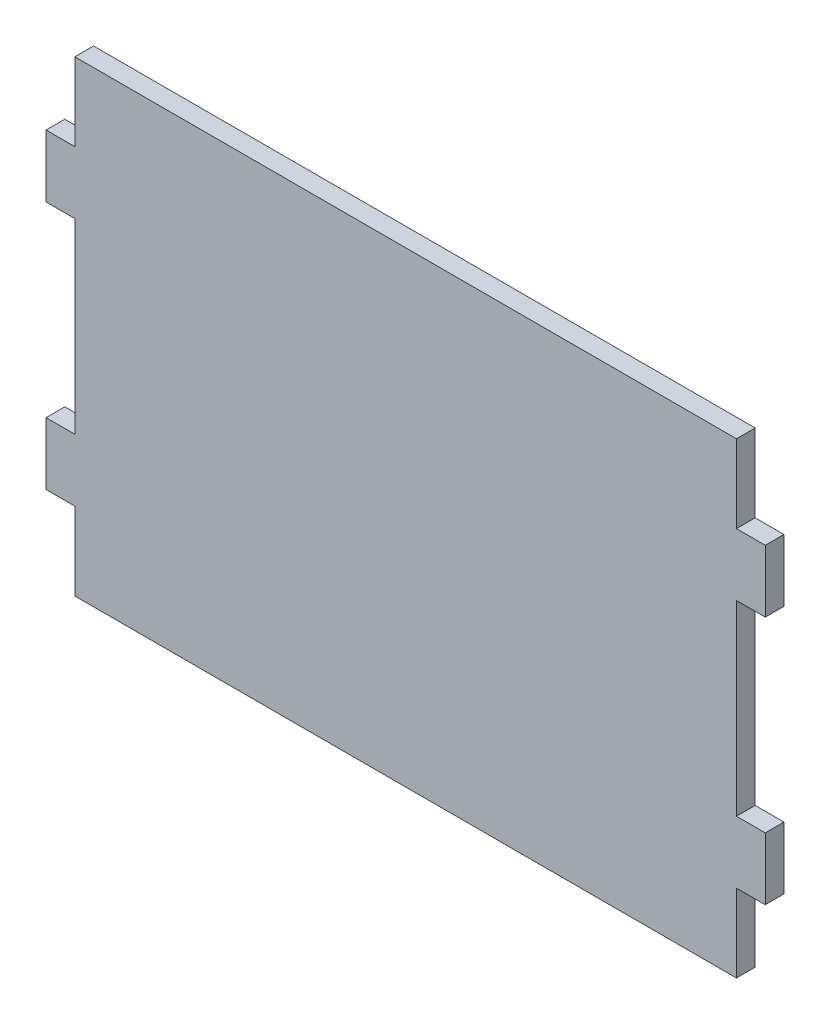
ISO-10303-21;
HEADER;
FILE_DESCRIPTION(('STEP AP214'),'2;1');
FILE_NAME('part.step','',(''),(''),'','','');
FILE_SCHEMA(('AUTOMOTIVE_DESIGN { 1 0 10303 214 1 1 1 1 }'));
ENDSEC;
DATA;
#1=APPLICATION_CONTEXT('core data for automotive mechanical design processes');
#2=APPLICATION_PROTOCOL_DEFINITION('international standard','automotive_design',2000,#1);
#3=PRODUCT_CONTEXT('',#1,'mechanical');
#4=PRODUCT('Part','Part','',(#3));
#5=PRODUCT_RELATED_PRODUCT_CATEGORY('part','',(#4));
#6=PRODUCT_DEFINITION_FORMATION('','',#4);
#7=PRODUCT_DEFINITION_CONTEXT('part definition',#1,'design');
#8=PRODUCT_DEFINITION('design','',#6,#7);
#9=PRODUCT_DEFINITION_SHAPE('','',#8);
#10=(LENGTH_UNIT() NAMED_UNIT(*) SI_UNIT(.MILLI.,.METRE.));
#11=(NAMED_UNIT(*) PLANE_ANGLE_UNIT() SI_UNIT($,.RADIAN.));
#12=(NAMED_UNIT(*) SI_UNIT($,.STERADIAN.) SOLID_ANGLE_UNIT());
#13=UNCERTAINTY_MEASURE_WITH_UNIT(LENGTH_MEASURE(1.E-05),#10,'distance_accuracy_value','');
#14=(GEOMETRIC_REPRESENTATION_CONTEXT(3) GLOBAL_UNCERTAINTY_ASSIGNED_CONTEXT((#13)) GLOBAL_UNIT_ASSIGNED_CONTEXT((#10,
#11,#12)) REPRESENTATION_CONTEXT('',''));
#15=CARTESIAN_POINT('',(0.,0.,0.));
#16=DIRECTION('',(0.,0.,1.));
#17=DIRECTION('',(1.,0.,0.));
#18=AXIS2_PLACEMENT_3D('',#15,#16,#17);
#19=CARTESIAN_POINT('',(212.5,5.89805981832114E-13,12.));
#20=DIRECTION('',(1.,0.,0.));
#21=DIRECTION('',(0.,1.,0.));
#22=AXIS2_PLACEMENT_3D('',#19,#20,#21);
#23=PLANE('',#22);
#24=DIRECTION('',(0.,-1.,0.));
#25=VECTOR('',#24,1.);
#26=CARTESIAN_POINT('',(212.5,5.89805981832114E-13,0.));
#27=LINE('',#26,#25);
#28=CARTESIAN_POINT('',(212.5,150.,0.));
#29=VERTEX_POINT('',#28);
#30=CARTESIAN_POINT('',(212.5,99.9999999999999,0.));
#31=VERTEX_POINT('',#30);
#32=EDGE_CURVE('E203',#29,#31,#27,.T.);
#33=ORIENTED_EDGE('',*,*,#32,.F.);
#34=DIRECTION('',(0.,0.,-1.));
#35=VECTOR('',#34,1.);
#36=CARTESIAN_POINT('',(212.5,150.,12.));
#37=LINE('',#36,#35);
#38=CARTESIAN_POINT('',(212.5,150.,12.));
#39=VERTEX_POINT('',#38);
#40=EDGE_CURVE('E11',#39,#29,#37,.T.);
#41=ORIENTED_EDGE('',*,*,#40,.F.);
#42=DIRECTION('',(0.,-1.,0.));
#43=VECTOR('',#42,1.);
#44=CARTESIAN_POINT('',(212.5,5.89805981832114E-13,12.));
#45=LINE('',#44,#43);
#46=CARTESIAN_POINT('',(212.5,99.9999999999999,12.));
#47=VERTEX_POINT('',#46);
#48=EDGE_CURVE('E250',#39,#47,#45,.T.);
#49=ORIENTED_EDGE('',*,*,#48,.T.);
#50=DIRECTION('',(0.,0.,-1.));
#51=VECTOR('',#50,1.);
#52=CARTESIAN_POINT('',(212.5,99.9999999999999,12.));
#53=LINE('',#52,#51);
#54=EDGE_CURVE('E54',#47,#31,#53,.T.);
#55=ORIENTED_EDGE('',*,*,#54,.T.);
#56=EDGE_LOOP('',(#33,#41,#49,#55));
#57=FACE_BOUND('',#56,.T.);
#58=ADVANCED_FACE('F37',(#57),#23,.T.);
#59=CARTESIAN_POINT('',(0.,150.,12.));
#60=DIRECTION('',(0.,1.,0.));
#61=DIRECTION('',(-1.,0.,0.));
#62=AXIS2_PLACEMENT_3D('',#59,#60,#61);
#63=PLANE('',#62);
#64=DIRECTION('',(1.,0.,0.));
#65=VECTOR('',#64,1.);
#66=CARTESIAN_POINT('',(0.,150.,0.));
#67=LINE('',#66,#65);
#68=CARTESIAN_POINT('',(-212.5,150.,0.));
#69=VERTEX_POINT('',#68);
#70=EDGE_CURVE('E205',#69,#29,#67,.T.);
#71=ORIENTED_EDGE('',*,*,#70,.F.);
#72=DIRECTION('',(0.,0.,-1.));
#73=VECTOR('',#72,1.);
#74=CARTESIAN_POINT('',(-212.5,150.,12.));
#75=LINE('',#74,#73);
#76=CARTESIAN_POINT('',(-212.5,150.,12.));
#77=VERTEX_POINT('',#76);
#78=EDGE_CURVE('E46',#77,#69,#75,.T.);
#79=ORIENTED_EDGE('',*,*,#78,.F.);
#80=DIRECTION('',(1.,0.,0.));
#81=VECTOR('',#80,1.);
#82=CARTESIAN_POINT('',(0.,150.,12.));
#83=LINE('',#82,#81);
#84=EDGE_CURVE('E297',#77,#39,#83,.T.);
#85=ORIENTED_EDGE('',*,*,#84,.T.);
#86=ORIENTED_EDGE('',*,*,#40,.T.);
#87=EDGE_LOOP('',(#71,#79,#85,#86));
#88=FACE_BOUND('',#87,.T.);
#89=ADVANCED_FACE('F39',(#88),#63,.T.);
#90=CARTESIAN_POINT('',(-212.5,0.,12.));
#91=DIRECTION('',(1.,0.,0.));
#92=DIRECTION('',(0.,0.,-1.));
#93=AXIS2_PLACEMENT_3D('',#90,#91,#92);
#94=PLANE('',#93);
#95=DIRECTION('',(0.,-1.,0.));
#96=VECTOR('',#95,1.);
#97=CARTESIAN_POINT('',(-212.5,0.,0.));
#98=LINE('',#97,#96);
#99=CARTESIAN_POINT('',(-212.5,100.,0.));
#100=VERTEX_POINT('',#99);
#101=EDGE_CURVE('E210',#69,#100,#98,.T.);
#102=ORIENTED_EDGE('',*,*,#101,.T.);
#103=DIRECTION('',(0.,0.,-1.));
#104=VECTOR('',#103,1.);
#105=CARTESIAN_POINT('',(-212.5,100.,12.));
#106=LINE('',#105,#104);
#107=CARTESIAN_POINT('',(-212.5,100.,12.));
#108=VERTEX_POINT('',#107);
#109=EDGE_CURVE('E282',#108,#100,#106,.T.);
#110=ORIENTED_EDGE('',*,*,#109,.F.);
#111=DIRECTION('',(0.,-1.,0.));
#112=VECTOR('',#111,1.);
#113=CARTESIAN_POINT('',(-212.5,0.,12.));
#114=LINE('',#113,#112);
#115=EDGE_CURVE('E289',#77,#108,#114,.T.);
#116=ORIENTED_EDGE('',*,*,#115,.F.);
#117=ORIENTED_EDGE('',*,*,#78,.T.);
#118=EDGE_LOOP('',(#102,#110,#116,#117));
#119=FACE_BOUND('',#118,.T.);
#120=ADVANCED_FACE('F287',(#119),#94,.F.);
#121=CARTESIAN_POINT('',(-3.00060276925718E-13,100.000000000001,12.));
#122=DIRECTION('',(0.,-1.,0.));
#123=DIRECTION('',(1.,0.,0.));
#124=AXIS2_PLACEMENT_3D('',#121,#122,#123);
#125=PLANE('',#124);
#126=DIRECTION('',(-1.,0.,0.));
#127=VECTOR('',#126,1.);
#128=CARTESIAN_POINT('',(-3.00060276925718E-13,100.000000000001,0.));
#129=LINE('',#128,#127);
#130=CARTESIAN_POINT('',(-231.,99.9999999999999,0.));
#131=VERTEX_POINT('',#130);
#132=EDGE_CURVE('E212',#100,#131,#129,.T.);
#133=ORIENTED_EDGE('',*,*,#132,.T.);
#134=DIRECTION('',(0.,0.,-1.));
#135=VECTOR('',#134,1.);
#136=CARTESIAN_POINT('',(-231.,99.9999999999999,12.));
#137=LINE('',#136,#135);
#138=CARTESIAN_POINT('',(-231.,99.9999999999999,12.));
#139=VERTEX_POINT('',#138);
#140=EDGE_CURVE('E280',#139,#131,#137,.T.);
#141=ORIENTED_EDGE('',*,*,#140,.F.);
#142=DIRECTION('',(-1.,0.,0.));
#143=VECTOR('',#142,1.);
#144=CARTESIAN_POINT('',(-3.00060276925718E-13,100.000000000001,12.));
#145=LINE('',#144,#143);
#146=EDGE_CURVE('E388',#108,#139,#145,.T.);
#147=ORIENTED_EDGE('',*,*,#146,.F.);
#148=ORIENTED_EDGE('',*,*,#109,.T.);
#149=EDGE_LOOP('',(#133,#141,#147,#148));
#150=FACE_BOUND('',#149,.T.);
#151=ADVANCED_FACE('F417',(#150),#125,.F.);
#152=CARTESIAN_POINT('',(-231.,0.,12.));
#153=DIRECTION('',(-1.,0.,0.));
#154=DIRECTION('',(0.,-1.,0.));
#155=AXIS2_PLACEMENT_3D('',#152,#153,#154);
#156=PLANE('',#155);
#157=DIRECTION('',(0.,1.,0.));
#158=VECTOR('',#157,1.);
#159=CARTESIAN_POINT('',(-231.,0.,0.));
#160=LINE('',#159,#158);
#161=CARTESIAN_POINT('',(-231.,59.9999999999999,0.));
#162=VERTEX_POINT('',#161);
#163=EDGE_CURVE('E217',#162,#131,#160,.T.);
#164=ORIENTED_EDGE('',*,*,#163,.F.);
#165=DIRECTION('',(0.,0.,-1.));
#166=VECTOR('',#165,1.);
#167=CARTESIAN_POINT('',(-231.,59.9999999999999,12.));
#168=LINE('',#167,#166);
#169=CARTESIAN_POINT('',(-231.,59.9999999999999,12.));
#170=VERTEX_POINT('',#169);
#171=EDGE_CURVE('E278',#170,#162,#168,.T.);
#172=ORIENTED_EDGE('',*,*,#171,.F.);
#173=DIRECTION('',(0.,1.,0.));
#174=VECTOR('',#173,1.);
#175=CARTESIAN_POINT('',(-231.,0.,12.));
#176=LINE('',#175,#174);
#177=EDGE_CURVE('E392',#170,#139,#176,.T.);
#178=ORIENTED_EDGE('',*,*,#177,.T.);
#179=ORIENTED_EDGE('',*,*,#140,.T.);
#180=EDGE_LOOP('',(#164,#172,#178,#179));
#181=FACE_BOUND('',#180,.T.);
#182=ADVANCED_FACE('F415',(#181),#156,.T.);
#183=CARTESIAN_POINT('',(-1.80036166155431E-13,60.0000000000006,12.));
#184=DIRECTION('',(0.,-1.,0.));
#185=DIRECTION('',(1.,0.,0.));
#186=AXIS2_PLACEMENT_3D('',#183,#184,#185);
#187=PLANE('',#186);
#188=DIRECTION('',(-1.,0.,0.));
#189=VECTOR('',#188,1.);
#190=CARTESIAN_POINT('',(-1.80036166155431E-13,60.0000000000006,0.));
#191=LINE('',#190,#189);
#192=CARTESIAN_POINT('',(-212.5,60.,0.));
#193=VERTEX_POINT('',#192);
#194=EDGE_CURVE('E220',#193,#162,#191,.T.);
#195=ORIENTED_EDGE('',*,*,#194,.F.);
#196=DIRECTION('',(0.,0.,-1.));
#197=VECTOR('',#196,1.);
#198=CARTESIAN_POINT('',(-212.5,60.,12.));
#199=LINE('',#198,#197);
#200=CARTESIAN_POINT('',(-212.5,60.,12.));
#201=VERTEX_POINT('',#200);
#202=EDGE_CURVE('E276',#201,#193,#199,.T.);
#203=ORIENTED_EDGE('',*,*,#202,.F.);
#204=DIRECTION('',(-1.,0.,0.));
#205=VECTOR('',#204,1.);
#206=CARTESIAN_POINT('',(-1.80036166155431E-13,60.0000000000006,12.));
#207=LINE('',#206,#205);
#208=EDGE_CURVE('E394',#201,#170,#207,.T.);
#209=ORIENTED_EDGE('',*,*,#208,.T.);
#210=ORIENTED_EDGE('',*,*,#171,.T.);
#211=EDGE_LOOP('',(#195,#203,#209,#210));
#212=FACE_BOUND('',#211,.T.);
#213=ADVANCED_FACE('F412',(#212),#187,.T.);
#214=CARTESIAN_POINT('',(-212.5,-60.,0.));
#215=VERTEX_POINT('',#214);
#216=EDGE_CURVE('E214',#193,#215,#98,.T.);
#217=ORIENTED_EDGE('',*,*,#216,.T.);
#218=DIRECTION('',(0.,0.,-1.));
#219=VECTOR('',#218,1.);
#220=CARTESIAN_POINT('',(-212.5,-60.,12.));
#221=LINE('',#220,#219);
#222=CARTESIAN_POINT('',(-212.5,-60.,12.));
#223=VERTEX_POINT('',#222);
#224=EDGE_CURVE('E273',#223,#215,#221,.T.);
#225=ORIENTED_EDGE('',*,*,#224,.F.);
#226=EDGE_CURVE('E375',#201,#223,#114,.T.);
#227=ORIENTED_EDGE('',*,*,#226,.F.);
#228=ORIENTED_EDGE('',*,*,#202,.T.);
#229=EDGE_LOOP('',(#217,#225,#227,#228));
#230=FACE_BOUND('',#229,.T.);
#231=ADVANCED_FACE('F356',(#230),#94,.F.);
#232=CARTESIAN_POINT('',(2.02540686924856E-13,-59.9999999999993,12.));
#233=DIRECTION('',(0.,-1.,0.));
#234=DIRECTION('',(1.,0.,0.));
#235=AXIS2_PLACEMENT_3D('',#232,#233,#234);
#236=PLANE('',#235);
#237=DIRECTION('',(-1.,0.,0.));
#238=VECTOR('',#237,1.);
#239=CARTESIAN_POINT('',(2.02540686924856E-13,-59.9999999999993,0.));
#240=LINE('',#239,#238);
#241=CARTESIAN_POINT('',(-231.,-60.0000000000001,0.));
#242=VERTEX_POINT('',#241);
#243=EDGE_CURVE('E223',#215,#242,#240,.T.);
#244=ORIENTED_EDGE('',*,*,#243,.T.);
#245=DIRECTION('',(0.,0.,-1.));
#246=VECTOR('',#245,1.);
#247=CARTESIAN_POINT('',(-231.,-60.0000000000001,12.));
#248=LINE('',#247,#246);
#249=CARTESIAN_POINT('',(-231.,-60.0000000000001,12.));
#250=VERTEX_POINT('',#249);
#251=EDGE_CURVE('E271',#250,#242,#248,.T.);
#252=ORIENTED_EDGE('',*,*,#251,.F.);
#253=DIRECTION('',(-1.,0.,0.));
#254=VECTOR('',#253,1.);
#255=CARTESIAN_POINT('',(2.02540686924856E-13,-59.9999999999993,12.));
#256=LINE('',#255,#254);
#257=EDGE_CURVE('E364',#223,#250,#256,.T.);
#258=ORIENTED_EDGE('',*,*,#257,.F.);
#259=ORIENTED_EDGE('',*,*,#224,.T.);
#260=EDGE_LOOP('',(#244,#252,#258,#259));
#261=FACE_BOUND('',#260,.T.);
#262=ADVANCED_FACE('F362',(#261),#236,.F.);
#263=CARTESIAN_POINT('',(-231.,0.,12.));
#264=DIRECTION('',(-1.,0.,0.));
#265=DIRECTION('',(0.,-1.,0.));
#266=AXIS2_PLACEMENT_3D('',#263,#264,#265);
#267=PLANE('',#266);
#268=DIRECTION('',(0.,1.,0.));
#269=VECTOR('',#268,1.);
#270=CARTESIAN_POINT('',(-231.,0.,0.));
#271=LINE('',#270,#269);
#272=CARTESIAN_POINT('',(-231.,-100.,0.));
#273=VERTEX_POINT('',#272);
#274=EDGE_CURVE('E226',#273,#242,#271,.T.);
#275=ORIENTED_EDGE('',*,*,#274,.F.);
#276=DIRECTION('',(0.,0.,-1.));
#277=VECTOR('',#276,1.);
#278=CARTESIAN_POINT('',(-231.,-100.,12.));
#279=LINE('',#278,#277);
#280=CARTESIAN_POINT('',(-231.,-100.,12.));
#281=VERTEX_POINT('',#280);
#282=EDGE_CURVE('E269',#281,#273,#279,.T.);
#283=ORIENTED_EDGE('',*,*,#282,.F.);
#284=DIRECTION('',(0.,1.,0.));
#285=VECTOR('',#284,1.);
#286=CARTESIAN_POINT('',(-231.,0.,12.));
#287=LINE('',#286,#285);
#288=EDGE_CURVE('E370',#281,#250,#287,.T.);
#289=ORIENTED_EDGE('',*,*,#288,.T.);
#290=ORIENTED_EDGE('',*,*,#251,.T.);
#291=EDGE_LOOP('',(#275,#283,#289,#290));
#292=FACE_BOUND('',#291,.T.);
#293=ADVANCED_FACE('F367',(#292),#267,.T.);
#294=CARTESIAN_POINT('',(3.00060276925716E-13,-99.9999999999994,12.));
#295=DIRECTION('',(0.,-1.,0.));
#296=DIRECTION('',(1.,0.,0.));
#297=AXIS2_PLACEMENT_3D('',#294,#295,#296);
#298=PLANE('',#297);
#299=DIRECTION('',(-1.,0.,0.));
#300=VECTOR('',#299,1.);
#301=CARTESIAN_POINT('',(3.00060276925716E-13,-99.9999999999994,0.));
#302=LINE('',#301,#300);
#303=CARTESIAN_POINT('',(-212.5,-100.,0.));
#304=VERTEX_POINT('',#303);
#305=EDGE_CURVE('E229',#304,#273,#302,.T.);
#306=ORIENTED_EDGE('',*,*,#305,.F.);
#307=DIRECTION('',(0.,0.,-1.));
#308=VECTOR('',#307,1.);
#309=CARTESIAN_POINT('',(-212.5,-100.,12.));
#310=LINE('',#309,#308);
#311=CARTESIAN_POINT('',(-212.5,-100.,12.));
#312=VERTEX_POINT('',#311);
#313=EDGE_CURVE('E267',#312,#304,#310,.T.);
#314=ORIENTED_EDGE('',*,*,#313,.F.);
#315=DIRECTION('',(-1.,0.,0.));
#316=VECTOR('',#315,1.);
#317=CARTESIAN_POINT('',(3.00060276925716E-13,-99.9999999999994,12.));
#318=LINE('',#317,#316);
#319=EDGE_CURVE('E372',#312,#281,#318,.T.);
#320=ORIENTED_EDGE('',*,*,#319,.T.);
#321=ORIENTED_EDGE('',*,*,#282,.T.);
#322=EDGE_LOOP('',(#306,#314,#320,#321));
#323=FACE_BOUND('',#322,.T.);
#324=ADVANCED_FACE('F399',(#323),#298,.T.);
#325=CARTESIAN_POINT('',(-212.5,-150.,0.));
#326=VERTEX_POINT('',#325);
#327=EDGE_CURVE('E213',#304,#326,#98,.T.);
#328=ORIENTED_EDGE('',*,*,#327,.T.);
#329=DIRECTION('',(0.,0.,-1.));
#330=VECTOR('',#329,1.);
#331=CARTESIAN_POINT('',(-212.5,-150.,12.));
#332=LINE('',#331,#330);
#333=CARTESIAN_POINT('',(-212.5,-150.,12.));
#334=VERTEX_POINT('',#333);
#335=EDGE_CURVE('E264',#334,#326,#332,.T.);
#336=ORIENTED_EDGE('',*,*,#335,.F.);
#337=EDGE_CURVE('E350',#312,#334,#114,.T.);
#338=ORIENTED_EDGE('',*,*,#337,.F.);
#339=ORIENTED_EDGE('',*,*,#313,.T.);
#340=EDGE_LOOP('',(#328,#336,#338,#339));
#341=FACE_BOUND('',#340,.T.);
#342=ADVANCED_FACE('F349',(#341),#94,.F.);
#343=CARTESIAN_POINT('',(0.,-150.,12.));
#344=DIRECTION('',(0.,1.,0.));
#345=DIRECTION('',(-1.,0.,0.));
#346=AXIS2_PLACEMENT_3D('',#343,#344,#345);
#347=PLANE('',#346);
#348=DIRECTION('',(1.,0.,0.));
#349=VECTOR('',#348,1.);
#350=CARTESIAN_POINT('',(0.,-150.,0.));
#351=LINE('',#350,#349);
#352=CARTESIAN_POINT('',(212.5,-150.,0.));
#353=VERTEX_POINT('',#352);
#354=EDGE_CURVE('E232',#326,#353,#351,.T.);
#355=ORIENTED_EDGE('',*,*,#354,.T.);
#356=DIRECTION('',(0.,0.,-1.));
#357=VECTOR('',#356,1.);
#358=CARTESIAN_POINT('',(212.5,-150.,12.));
#359=LINE('',#358,#357);
#360=CARTESIAN_POINT('',(212.5,-150.,12.));
#361=VERTEX_POINT('',#360);
#362=EDGE_CURVE('E262',#361,#353,#359,.T.);
#363=ORIENTED_EDGE('',*,*,#362,.F.);
#364=DIRECTION('',(1.,0.,0.));
#365=VECTOR('',#364,1.);
#366=CARTESIAN_POINT('',(0.,-150.,12.));
#367=LINE('',#366,#365);
#368=EDGE_CURVE('E346',#334,#361,#367,.T.);
#369=ORIENTED_EDGE('',*,*,#368,.F.);
#370=ORIENTED_EDGE('',*,*,#335,.T.);
#371=EDGE_LOOP('',(#355,#363,#369,#370));
#372=FACE_BOUND('',#371,.T.);
#373=ADVANCED_FACE('F319',(#372),#347,.F.);
#374=CARTESIAN_POINT('',(212.5,-100.,0.));
#375=VERTEX_POINT('',#374);
#376=EDGE_CURVE('E207',#375,#353,#27,.T.);
#377=ORIENTED_EDGE('',*,*,#376,.F.);
#378=DIRECTION('',(0.,0.,-1.));
#379=VECTOR('',#378,1.);
#380=CARTESIAN_POINT('',(212.5,-100.,12.));
#381=LINE('',#380,#379);
#382=CARTESIAN_POINT('',(212.5,-100.,12.));
#383=VERTEX_POINT('',#382);
#384=EDGE_CURVE('E260',#383,#375,#381,.T.);
#385=ORIENTED_EDGE('',*,*,#384,.F.);
#386=EDGE_CURVE('E342',#383,#361,#45,.T.);
#387=ORIENTED_EDGE('',*,*,#386,.T.);
#388=ORIENTED_EDGE('',*,*,#362,.T.);
#389=EDGE_LOOP('',(#377,#385,#387,#388));
#390=FACE_BOUND('',#389,.T.);
#391=ADVANCED_FACE('F310',(#390),#23,.T.);
#392=CARTESIAN_POINT('',(0.,-100.,12.));
#393=DIRECTION('',(0.,-1.,0.));
#394=DIRECTION('',(0.,0.,-1.));
#395=AXIS2_PLACEMENT_3D('',#392,#393,#394);
#396=PLANE('',#395);
#397=DIRECTION('',(-1.,0.,0.));
#398=VECTOR('',#397,1.);
#399=CARTESIAN_POINT('',(0.,-100.,0.));
#400=LINE('',#399,#398);
#401=CARTESIAN_POINT('',(231.,-100.,0.));
#402=VERTEX_POINT('',#401);
#403=EDGE_CURVE('E235',#402,#375,#400,.T.);
#404=ORIENTED_EDGE('',*,*,#403,.F.);
#405=DIRECTION('',(0.,0.,-1.));
#406=VECTOR('',#405,1.);
#407=CARTESIAN_POINT('',(231.,-100.,12.));
#408=LINE('',#407,#406);
#409=CARTESIAN_POINT('',(231.,-100.,12.));
#410=VERTEX_POINT('',#409);
#411=EDGE_CURVE('E258',#410,#402,#408,.T.);
#412=ORIENTED_EDGE('',*,*,#411,.F.);
#413=DIRECTION('',(-1.,0.,0.));
#414=VECTOR('',#413,1.);
#415=CARTESIAN_POINT('',(0.,-100.,12.));
#416=LINE('',#415,#414);
#417=EDGE_CURVE('E380',#410,#383,#416,.T.);
#418=ORIENTED_EDGE('',*,*,#417,.T.);
#419=ORIENTED_EDGE('',*,*,#384,.T.);
#420=EDGE_LOOP('',(#404,#412,#418,#419));
#421=FACE_BOUND('',#420,.T.);
#422=ADVANCED_FACE('F318',(#421),#396,.T.);
#423=CARTESIAN_POINT('',(231.,0.,12.));
#424=DIRECTION('',(-1.,0.,0.));
#425=DIRECTION('',(0.,-1.,0.));
#426=AXIS2_PLACEMENT_3D('',#423,#424,#425);
#427=PLANE('',#426);
#428=DIRECTION('',(0.,1.,0.));
#429=VECTOR('',#428,1.);
#430=CARTESIAN_POINT('',(231.,0.,0.));
#431=LINE('',#430,#429);
#432=CARTESIAN_POINT('',(231.,-60.,0.));
#433=VERTEX_POINT('',#432);
#434=EDGE_CURVE('E238',#402,#433,#431,.T.);
#435=ORIENTED_EDGE('',*,*,#434,.T.);
#436=DIRECTION('',(0.,0.,-1.));
#437=VECTOR('',#436,1.);
#438=CARTESIAN_POINT('',(231.,-60.,12.));
#439=LINE('',#438,#437);
#440=CARTESIAN_POINT('',(231.,-60.,12.));
#441=VERTEX_POINT('',#440);
#442=EDGE_CURVE('E256',#441,#433,#439,.T.);
#443=ORIENTED_EDGE('',*,*,#442,.F.);
#444=DIRECTION('',(0.,1.,0.));
#445=VECTOR('',#444,1.);
#446=CARTESIAN_POINT('',(231.,0.,12.));
#447=LINE('',#446,#445);
#448=EDGE_CURVE('E383',#410,#441,#447,.T.);
#449=ORIENTED_EDGE('',*,*,#448,.F.);
#450=ORIENTED_EDGE('',*,*,#411,.T.);
#451=EDGE_LOOP('',(#435,#443,#449,#450));
#452=FACE_BOUND('',#451,.T.);
#453=ADVANCED_FACE('F328',(#452),#427,.F.);
#454=CARTESIAN_POINT('',(0.,-60.,12.));
#455=DIRECTION('',(0.,1.,0.));
#456=DIRECTION('',(-1.,0.,0.));
#457=AXIS2_PLACEMENT_3D('',#454,#455,#456);
#458=PLANE('',#457);
#459=DIRECTION('',(1.,0.,0.));
#460=VECTOR('',#459,1.);
#461=CARTESIAN_POINT('',(0.,-60.,0.));
#462=LINE('',#461,#460);
#463=CARTESIAN_POINT('',(212.5,-60.,0.));
#464=VERTEX_POINT('',#463);
#465=EDGE_CURVE('E241',#464,#433,#462,.T.);
#466=ORIENTED_EDGE('',*,*,#465,.F.);
#467=DIRECTION('',(0.,0.,-1.));
#468=VECTOR('',#467,1.);
#469=CARTESIAN_POINT('',(212.5,-60.,12.));
#470=LINE('',#469,#468);
#471=CARTESIAN_POINT('',(212.5,-60.,12.));
#472=VERTEX_POINT('',#471);
#473=EDGE_CURVE('E254',#472,#464,#470,.T.);
#474=ORIENTED_EDGE('',*,*,#473,.F.);
#475=DIRECTION('',(1.,0.,0.));
#476=VECTOR('',#475,1.);
#477=CARTESIAN_POINT('',(0.,-60.,12.));
#478=LINE('',#477,#476);
#479=EDGE_CURVE('E384',#472,#441,#478,.T.);
#480=ORIENTED_EDGE('',*,*,#479,.T.);
#481=ORIENTED_EDGE('',*,*,#442,.T.);
#482=EDGE_LOOP('',(#466,#474,#480,#481));
#483=FACE_BOUND('',#482,.T.);
#484=ADVANCED_FACE('F322',(#483),#458,.T.);
#485=CARTESIAN_POINT('',(212.5,60.,0.));
#486=VERTEX_POINT('',#485);
#487=EDGE_CURVE('E206',#486,#464,#27,.T.);
#488=ORIENTED_EDGE('',*,*,#487,.F.);
#489=DIRECTION('',(0.,0.,-1.));
#490=VECTOR('',#489,1.);
#491=CARTESIAN_POINT('',(212.5,60.,12.));
#492=LINE('',#491,#490);
#493=CARTESIAN_POINT('',(212.5,60.,12.));
#494=VERTEX_POINT('',#493);
#495=EDGE_CURVE('E195',#494,#486,#492,.T.);
#496=ORIENTED_EDGE('',*,*,#495,.F.);
#497=EDGE_CURVE('E185',#494,#472,#45,.T.);
#498=ORIENTED_EDGE('',*,*,#497,.T.);
#499=ORIENTED_EDGE('',*,*,#473,.T.);
#500=EDGE_LOOP('',(#488,#496,#498,#499));
#501=FACE_BOUND('',#500,.T.);
#502=ADVANCED_FACE('F311',(#501),#23,.T.);
#503=CARTESIAN_POINT('',(0.,60.,12.));
#504=DIRECTION('',(0.,1.,0.));
#505=DIRECTION('',(0.,0.,1.));
#506=AXIS2_PLACEMENT_3D('',#503,#504,#505);
#507=PLANE('',#506);
#508=DIRECTION('',(1.,0.,0.));
#509=VECTOR('',#508,1.);
#510=CARTESIAN_POINT('',(0.,60.,0.));
#511=LINE('',#510,#509);
#512=CARTESIAN_POINT('',(231.,60.,0.));
#513=VERTEX_POINT('',#512);
#514=EDGE_CURVE('E192',#486,#513,#511,.T.);
#515=ORIENTED_EDGE('',*,*,#514,.T.);
#516=DIRECTION('',(0.,0.,-1.));
#517=VECTOR('',#516,1.);
#518=CARTESIAN_POINT('',(231.,60.,12.));
#519=LINE('',#518,#517);
#520=CARTESIAN_POINT('',(231.,60.,12.));
#521=VERTEX_POINT('',#520);
#522=EDGE_CURVE('E189',#521,#513,#519,.T.);
#523=ORIENTED_EDGE('',*,*,#522,.F.);
#524=DIRECTION('',(1.,0.,0.));
#525=VECTOR('',#524,1.);
#526=CARTESIAN_POINT('',(0.,60.,12.));
#527=LINE('',#526,#525);
#528=EDGE_CURVE('E177',#494,#521,#527,.T.);
#529=ORIENTED_EDGE('',*,*,#528,.F.);
#530=ORIENTED_EDGE('',*,*,#495,.T.);
#531=EDGE_LOOP('',(#515,#523,#529,#530));
#532=FACE_BOUND('',#531,.T.);
#533=ADVANCED_FACE('F190',(#532),#507,.F.);
#534=CARTESIAN_POINT('',(231.,0.,12.));
#535=DIRECTION('',(-1.,0.,0.));
#536=DIRECTION('',(0.,-1.,0.));
#537=AXIS2_PLACEMENT_3D('',#534,#535,#536);
#538=PLANE('',#537);
#539=DIRECTION('',(0.,1.,0.));
#540=VECTOR('',#539,1.);
#541=CARTESIAN_POINT('',(231.,0.,0.));
#542=LINE('',#541,#540);
#543=CARTESIAN_POINT('',(231.,100.,0.));
#544=VERTEX_POINT('',#543);
#545=EDGE_CURVE('E245',#513,#544,#542,.T.);
#546=ORIENTED_EDGE('',*,*,#545,.T.);
#547=DIRECTION('',(0.,0.,-1.));
#548=VECTOR('',#547,1.);
#549=CARTESIAN_POINT('',(231.,100.,12.));
#550=LINE('',#549,#548);
#551=CARTESIAN_POINT('',(231.,100.,12.));
#552=VERTEX_POINT('',#551);
#553=EDGE_CURVE('E116',#552,#544,#550,.T.);
#554=ORIENTED_EDGE('',*,*,#553,.F.);
#555=DIRECTION('',(0.,1.,0.));
#556=VECTOR('',#555,1.);
#557=CARTESIAN_POINT('',(231.,0.,12.));
#558=LINE('',#557,#556);
#559=EDGE_CURVE('E182',#521,#552,#558,.T.);
#560=ORIENTED_EDGE('',*,*,#559,.F.);
#561=ORIENTED_EDGE('',*,*,#522,.T.);
#562=EDGE_LOOP('',(#546,#554,#560,#561));
#563=FACE_BOUND('',#562,.T.);
#564=ADVANCED_FACE('F197',(#563),#538,.F.);
#565=CARTESIAN_POINT('',(0.,100.,12.));
#566=DIRECTION('',(0.,1.,0.));
#567=DIRECTION('',(0.,0.,1.));
#568=AXIS2_PLACEMENT_3D('',#565,#566,#567);
#569=PLANE('',#568);
#570=DIRECTION('',(1.,0.,0.));
#571=VECTOR('',#570,1.);
#572=CARTESIAN_POINT('',(0.,100.,0.));
#573=LINE('',#572,#571);
#574=EDGE_CURVE('E247',#31,#544,#573,.T.);
#575=ORIENTED_EDGE('',*,*,#574,.F.);
#576=ORIENTED_EDGE('',*,*,#54,.F.);
#577=DIRECTION('',(1.,0.,0.));
#578=VECTOR('',#577,1.);
#579=CARTESIAN_POINT('',(0.,100.,12.));
#580=LINE('',#579,#578);
#581=EDGE_CURVE('E198',#47,#552,#580,.T.);
#582=ORIENTED_EDGE('',*,*,#581,.T.);
#583=ORIENTED_EDGE('',*,*,#553,.T.);
#584=EDGE_LOOP('',(#575,#576,#582,#583));
#585=FACE_BOUND('',#584,.T.);
#586=ADVANCED_FACE('F298',(#585),#569,.T.);
#587=CARTESIAN_POINT('',(0.,0.,12.));
#588=DIRECTION('',(0.,0.,1.));
#589=DIRECTION('',(1.,0.,0.));
#590=AXIS2_PLACEMENT_3D('',#587,#588,#589);
#591=PLANE('',#590);
#592=ORIENTED_EDGE('',*,*,#48,.F.);
#593=ORIENTED_EDGE('',*,*,#84,.F.);
#594=ORIENTED_EDGE('',*,*,#115,.T.);
#595=ORIENTED_EDGE('',*,*,#146,.T.);
#596=ORIENTED_EDGE('',*,*,#177,.F.);
#597=ORIENTED_EDGE('',*,*,#208,.F.);
#598=ORIENTED_EDGE('',*,*,#226,.T.);
#599=ORIENTED_EDGE('',*,*,#257,.T.);
#600=ORIENTED_EDGE('',*,*,#288,.F.);
#601=ORIENTED_EDGE('',*,*,#319,.F.);
#602=ORIENTED_EDGE('',*,*,#337,.T.);
#603=ORIENTED_EDGE('',*,*,#368,.T.);
#604=ORIENTED_EDGE('',*,*,#386,.F.);
#605=ORIENTED_EDGE('',*,*,#417,.F.);
#606=ORIENTED_EDGE('',*,*,#448,.T.);
#607=ORIENTED_EDGE('',*,*,#479,.F.);
#608=ORIENTED_EDGE('',*,*,#497,.F.);
#609=ORIENTED_EDGE('',*,*,#528,.T.);
#610=ORIENTED_EDGE('',*,*,#559,.T.);
#611=ORIENTED_EDGE('',*,*,#581,.F.);
#612=EDGE_LOOP('',(#592,#593,#594,#595,#596,#597,#598,#599,#600,#601,#602,#603,#604,#605,#606,
#607,#608,#609,#610,#611));
#613=FACE_BOUND('',#612,.T.);
#614=ADVANCED_FACE('F179',(#613),#591,.T.);
#615=CARTESIAN_POINT('',(0.,0.,0.));
#616=DIRECTION('',(0.,0.,1.));
#617=DIRECTION('',(1.,0.,0.));
#618=AXIS2_PLACEMENT_3D('',#615,#616,#617);
#619=PLANE('',#618);
#620=ORIENTED_EDGE('',*,*,#32,.T.);
#621=ORIENTED_EDGE('',*,*,#574,.T.);
#622=ORIENTED_EDGE('',*,*,#545,.F.);
#623=ORIENTED_EDGE('',*,*,#514,.F.);
#624=ORIENTED_EDGE('',*,*,#487,.T.);
#625=ORIENTED_EDGE('',*,*,#465,.T.);
#626=ORIENTED_EDGE('',*,*,#434,.F.);
#627=ORIENTED_EDGE('',*,*,#403,.T.);
#628=ORIENTED_EDGE('',*,*,#376,.T.);
#629=ORIENTED_EDGE('',*,*,#354,.F.);
#630=ORIENTED_EDGE('',*,*,#327,.F.);
#631=ORIENTED_EDGE('',*,*,#305,.T.);
#632=ORIENTED_EDGE('',*,*,#274,.T.);
#633=ORIENTED_EDGE('',*,*,#243,.F.);
#634=ORIENTED_EDGE('',*,*,#216,.F.);
#635=ORIENTED_EDGE('',*,*,#194,.T.);
#636=ORIENTED_EDGE('',*,*,#163,.T.);
#637=ORIENTED_EDGE('',*,*,#132,.F.);
#638=ORIENTED_EDGE('',*,*,#101,.F.);
#639=ORIENTED_EDGE('',*,*,#70,.T.);
#640=EDGE_LOOP('',(#620,#621,#622,#623,#624,#625,#626,#627,#628,#629,#630,#631,#632,#633,#634,
#635,#636,#637,#638,#639));
#641=FACE_BOUND('',#640,.T.);
#642=ADVANCED_FACE('F296',(#641),#619,.F.);
#643=CLOSED_SHELL('',(#58,#89,#120,#151,#182,#213,#231,#262,#293,#324,#342,#373,#391,#422,#453,
#484,#502,#533,#564,#586,#614,#642));
#644=MANIFOLD_SOLID_BREP('B2',#643);
#645=ADVANCED_BREP_SHAPE_REPRESENTATION('',(#18,#644),#14);
#646=SHAPE_DEFINITION_REPRESENTATION(#9,#645);
ENDSEC;
END-ISO-10303-21;
